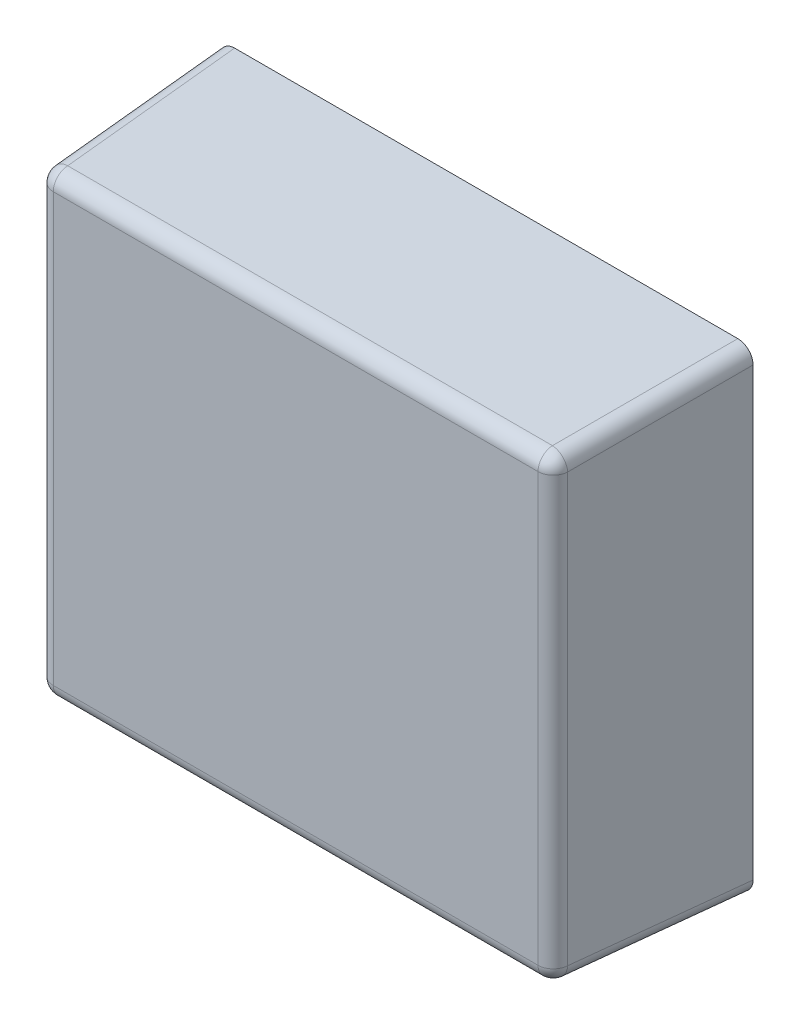
ISO-10303-21;
HEADER;
FILE_DESCRIPTION(('STEP AP214'),'2;1');
FILE_NAME('part.step','',(''),(''),'','','');
FILE_SCHEMA(('AUTOMOTIVE_DESIGN { 1 0 10303 214 1 1 1 1 }'));
ENDSEC;
DATA;
#1=APPLICATION_CONTEXT('core data for automotive mechanical design processes');
#2=APPLICATION_PROTOCOL_DEFINITION('international standard','automotive_design',2000,#1);
#3=PRODUCT_CONTEXT('',#1,'mechanical');
#4=PRODUCT('Part','Part','',(#3));
#5=PRODUCT_RELATED_PRODUCT_CATEGORY('part','',(#4));
#6=PRODUCT_DEFINITION_FORMATION('','',#4);
#7=PRODUCT_DEFINITION_CONTEXT('part definition',#1,'design');
#8=PRODUCT_DEFINITION('design','',#6,#7);
#9=PRODUCT_DEFINITION_SHAPE('','',#8);
#10=(LENGTH_UNIT() NAMED_UNIT(*) SI_UNIT(.MILLI.,.METRE.));
#11=(NAMED_UNIT(*) PLANE_ANGLE_UNIT() SI_UNIT($,.RADIAN.));
#12=(NAMED_UNIT(*) SI_UNIT($,.STERADIAN.) SOLID_ANGLE_UNIT());
#13=UNCERTAINTY_MEASURE_WITH_UNIT(LENGTH_MEASURE(1.E-05),#10,'distance_accuracy_value','');
#14=(GEOMETRIC_REPRESENTATION_CONTEXT(3) GLOBAL_UNCERTAINTY_ASSIGNED_CONTEXT((#13)) GLOBAL_UNIT_ASSIGNED_CONTEXT((#10,
#11,#12)) REPRESENTATION_CONTEXT('',''));
#15=CARTESIAN_POINT('',(0.,0.,0.));
#16=DIRECTION('',(0.,0.,1.));
#17=DIRECTION('',(1.,0.,0.));
#18=AXIS2_PLACEMENT_3D('',#15,#16,#17);
#19=CARTESIAN_POINT('',(-0.7,-0.625,0.5));
#20=DIRECTION('',(0.,0.,1.));
#21=DIRECTION('',(1.,0.,0.));
#22=AXIS2_PLACEMENT_3D('',#19,#20,#21);
#23=PLANE('',#22);
#24=DIRECTION('',(1.,0.,0.));
#25=VECTOR('',#24,1.);
#26=CARTESIAN_POINT('',(-0.35,-0.56083752769,0.5));
#27=LINE('',#26,#25);
#28=CARTESIAN_POINT('',(0.63583752769,-0.56083752769,0.5));
#29=VERTEX_POINT('',#28);
#30=CARTESIAN_POINT('',(-0.63583752769,-0.56083752769,0.5));
#31=VERTEX_POINT('',#30);
#32=EDGE_CURVE('E253',#29,#31,#27,.F.);
#33=ORIENTED_EDGE('',*,*,#32,.F.);
#34=DIRECTION('',(0.,-1.,0.));
#35=VECTOR('',#34,1.);
#36=CARTESIAN_POINT('',(0.63583752769,-0.3125,0.5));
#37=LINE('',#36,#35);
#38=CARTESIAN_POINT('',(0.63583752769,0.56083752769,0.5));
#39=VERTEX_POINT('',#38);
#40=EDGE_CURVE('E96',#39,#29,#37,.T.);
#41=ORIENTED_EDGE('',*,*,#40,.F.);
#42=DIRECTION('',(-1.,0.,0.));
#43=VECTOR('',#42,1.);
#44=CARTESIAN_POINT('',(-0.35,0.56083752769,0.5));
#45=LINE('',#44,#43);
#46=CARTESIAN_POINT('',(-0.63583752769,0.56083752769,0.5));
#47=VERTEX_POINT('',#46);
#48=EDGE_CURVE('E260',#47,#39,#45,.F.);
#49=ORIENTED_EDGE('',*,*,#48,.F.);
#50=DIRECTION('',(0.,-1.,0.));
#51=VECTOR('',#50,1.);
#52=CARTESIAN_POINT('',(-0.63583752769,-0.3125,0.5));
#53=LINE('',#52,#51);
#54=EDGE_CURVE('E258',#31,#47,#53,.F.);
#55=ORIENTED_EDGE('',*,*,#54,.F.);
#56=EDGE_LOOP('',(#33,#41,#49,#55));
#57=FACE_BOUND('',#56,.T.);
#58=ADVANCED_FACE('F17',(#57),#23,.T.);
#59=CARTESIAN_POINT('',(0.63583752769,-0.3125,0.46));
#60=DIRECTION('',(0.,-1.,0.));
#61=DIRECTION('',(1.,0.,0.));
#62=AXIS2_PLACEMENT_3D('',#59,#60,#61);
#63=CYLINDRICAL_SURFACE('',#62,0.04);
#64=CARTESIAN_POINT('',(0.63583752769,0.56083752769,0.46));
#65=DIRECTION('',(0.,-1.,0.));
#66=DIRECTION('',(1.,0.,0.));
#67=AXIS2_PLACEMENT_3D('',#64,#65,#66);
#68=CIRCLE('',#67,0.04);
#69=CARTESIAN_POINT('',(0.675782709080116,0.56083752769,0.462093438250006));
#70=VERTEX_POINT('',#69);
#71=EDGE_CURVE('E20',#39,#70,#68,.F.);
#72=ORIENTED_EDGE('',*,*,#71,.F.);
#73=ORIENTED_EDGE('',*,*,#40,.T.);
#74=CARTESIAN_POINT('',(0.63583752769,-0.56083752769,0.46));
#75=DIRECTION('',(0.,-1.,0.));
#76=DIRECTION('',(1.,0.,0.));
#77=AXIS2_PLACEMENT_3D('',#74,#75,#76);
#78=CIRCLE('',#77,0.04);
#79=CARTESIAN_POINT('',(0.675782709080077,-0.56083752769,0.462093438250466));
#80=VERTEX_POINT('',#79);
#81=EDGE_CURVE('E248',#80,#29,#78,.T.);
#82=ORIENTED_EDGE('',*,*,#81,.F.);
#83=DIRECTION('',(0.,1.,0.));
#84=VECTOR('',#83,1.);
#85=CARTESIAN_POINT('',(0.675782709080064,0.,0.462093438250003));
#86=LINE('',#85,#84);
#87=EDGE_CURVE('E119',#70,#80,#86,.F.);
#88=ORIENTED_EDGE('',*,*,#87,.F.);
#89=EDGE_LOOP('',(#72,#73,#82,#88));
#90=FACE_BOUND('',#89,.T.);
#91=ADVANCED_FACE('F105',(#90),#63,.T.);
#92=CARTESIAN_POINT('',(0.63583752769,0.56083752769,0.46));
#93=DIRECTION('',(0.556962487018036,0.556962487018204,0.61610516643604));
#94=DIRECTION('',(-0.741814855042063,-3.53134188557647E-13,0.670604742630802));
#95=AXIS2_PLACEMENT_3D('',#92,#93,#94);
#96=SPHERICAL_SURFACE('',#95,0.04);
#97=CARTESIAN_POINT('',(0.658116027170721,0.583116027170728,0.484644206657442));
#98=VERTEX_POINT('',#97);
#99=VERTEX_LOOP('',#98);
#100=FACE_BOUND('',#99,.T.);
#101=CARTESIAN_POINT('',(0.635837527689954,0.560837527689955,0.460000000000287));
#102=DIRECTION('',(-0.0522644276887224,-0.0522644276887224,0.997264688634236));
#103=DIRECTION('',(0.998629534754573,0.,0.0523359562429523));
#104=AXIS2_PLACEMENT_3D('',#101,#102,#103);
#105=CIRCLE('',#104,0.04);
#106=CARTESIAN_POINT('',(0.63583752769,0.600782709080116,0.462093438250006));
#107=VERTEX_POINT('',#106);
#108=EDGE_CURVE('E111',#107,#70,#105,.F.);
#109=ORIENTED_EDGE('',*,*,#108,.F.);
#110=CARTESIAN_POINT('',(0.63583752769,0.56083752769,0.46));
#111=DIRECTION('',(-1.,0.,0.));
#112=DIRECTION('',(0.,-1.,0.));
#113=AXIS2_PLACEMENT_3D('',#110,#111,#112);
#114=CIRCLE('',#113,0.04);
#115=EDGE_CURVE('E113',#39,#107,#114,.T.);
#116=ORIENTED_EDGE('',*,*,#115,.F.);
#117=ORIENTED_EDGE('',*,*,#71,.T.);
#118=EDGE_LOOP('',(#109,#116,#117));
#119=FACE_BOUND('',#118,.T.);
#120=ADVANCED_FACE('F101',(#100,#119),#96,.T.);
#121=CARTESIAN_POINT('',(-0.35,0.56083752769,0.46));
#122=DIRECTION('',(-1.,0.,0.));
#123=DIRECTION('',(0.,-1.,0.));
#124=AXIS2_PLACEMENT_3D('',#121,#122,#123);
#125=CYLINDRICAL_SURFACE('',#124,0.04);
#126=ORIENTED_EDGE('',*,*,#115,.T.);
#127=DIRECTION('',(1.,0.,0.));
#128=VECTOR('',#127,1.);
#129=CARTESIAN_POINT('',(0.,0.600782709080064,0.462093438250003));
#130=LINE('',#129,#128);
#131=CARTESIAN_POINT('',(-0.63583752769,0.600782709080116,0.462093438250006));
#132=VERTEX_POINT('',#131);
#133=EDGE_CURVE('E124',#132,#107,#130,.T.);
#134=ORIENTED_EDGE('',*,*,#133,.F.);
#135=CARTESIAN_POINT('',(-0.63583752769,0.56083752769,0.46));
#136=DIRECTION('',(-1.,0.,0.));
#137=DIRECTION('',(0.,-1.,0.));
#138=AXIS2_PLACEMENT_3D('',#135,#136,#137);
#139=CIRCLE('',#138,0.04);
#140=EDGE_CURVE('E259',#47,#132,#139,.T.);
#141=ORIENTED_EDGE('',*,*,#140,.F.);
#142=ORIENTED_EDGE('',*,*,#48,.T.);
#143=EDGE_LOOP('',(#126,#134,#141,#142));
#144=FACE_BOUND('',#143,.T.);
#145=ADVANCED_FACE('F104',(#144),#125,.T.);
#146=CARTESIAN_POINT('',(-0.63583752769,0.56083752769,0.46));
#147=DIRECTION('',(-0.556962487018036,0.556962487018204,0.61610516643604));
#148=DIRECTION('',(-0.741814855042063,3.53134188557647E-13,-0.670604742630802));
#149=AXIS2_PLACEMENT_3D('',#146,#147,#148);
#150=SPHERICAL_SURFACE('',#149,0.04);
#151=CARTESIAN_POINT('',(-0.658116027170721,0.583116027170728,0.484644206657442));
#152=VERTEX_POINT('',#151);
#153=VERTEX_LOOP('',#152);
#154=FACE_BOUND('',#153,.T.);
#155=ORIENTED_EDGE('',*,*,#140,.T.);
#156=CARTESIAN_POINT('',(-0.635837527689954,0.560837527689955,0.460000000000287));
#157=DIRECTION('',(0.0522644276887224,-0.0522644276887224,0.997264688634236));
#158=DIRECTION('',(0.998629534754573,0.,-0.0523359562429523));
#159=AXIS2_PLACEMENT_3D('',#156,#157,#158);
#160=CIRCLE('',#159,0.04);
#161=CARTESIAN_POINT('',(-0.675782709080116,0.560837527689999,0.462093438250006));
#162=VERTEX_POINT('',#161);
#163=EDGE_CURVE('E132',#162,#132,#160,.F.);
#164=ORIENTED_EDGE('',*,*,#163,.F.);
#165=CARTESIAN_POINT('',(-0.63583752769,0.56083752769,0.46));
#166=DIRECTION('',(0.,-1.,0.));
#167=DIRECTION('',(0.,0.,-1.));
#168=AXIS2_PLACEMENT_3D('',#165,#166,#167);
#169=CIRCLE('',#168,0.04);
#170=EDGE_CURVE('E256',#47,#162,#169,.T.);
#171=ORIENTED_EDGE('',*,*,#170,.F.);
#172=EDGE_LOOP('',(#155,#164,#171));
#173=FACE_BOUND('',#172,.T.);
#174=ADVANCED_FACE('F177',(#154,#173),#150,.T.);
#175=CARTESIAN_POINT('',(-0.63583752769,-0.3125,0.46));
#176=DIRECTION('',(0.,-1.,0.));
#177=DIRECTION('',(0.,0.,-1.));
#178=AXIS2_PLACEMENT_3D('',#175,#176,#177);
#179=CYLINDRICAL_SURFACE('',#178,0.04);
#180=ORIENTED_EDGE('',*,*,#170,.T.);
#181=DIRECTION('',(0.,1.,0.));
#182=VECTOR('',#181,1.);
#183=CARTESIAN_POINT('',(-0.675782709080064,0.,0.462093438250003));
#184=LINE('',#183,#182);
#185=CARTESIAN_POINT('',(-0.675782709080116,-0.56083752769,0.462093438250006));
#186=VERTEX_POINT('',#185);
#187=EDGE_CURVE('E171',#186,#162,#184,.T.);
#188=ORIENTED_EDGE('',*,*,#187,.F.);
#189=CARTESIAN_POINT('',(-0.63583752769,-0.56083752769,0.46));
#190=DIRECTION('',(0.,-1.,0.));
#191=DIRECTION('',(0.,0.,-1.));
#192=AXIS2_PLACEMENT_3D('',#189,#190,#191);
#193=CIRCLE('',#192,0.04);
#194=EDGE_CURVE('E254',#31,#186,#193,.T.);
#195=ORIENTED_EDGE('',*,*,#194,.F.);
#196=ORIENTED_EDGE('',*,*,#54,.T.);
#197=EDGE_LOOP('',(#180,#188,#195,#196));
#198=FACE_BOUND('',#197,.T.);
#199=ADVANCED_FACE('F167',(#198),#179,.T.);
#200=CARTESIAN_POINT('',(-0.63583752769,-0.56083752769,0.46));
#201=DIRECTION('',(-0.556962487018036,-0.556962487018204,0.61610516643604));
#202=DIRECTION('',(-0.741814855042063,-3.53134188557647E-13,-0.670604742630802));
#203=AXIS2_PLACEMENT_3D('',#200,#201,#202);
#204=SPHERICAL_SURFACE('',#203,0.04);
#205=CARTESIAN_POINT('',(-0.658116027170721,-0.583116027170728,0.484644206657442));
#206=VERTEX_POINT('',#205);
#207=VERTEX_LOOP('',#206);
#208=FACE_BOUND('',#207,.T.);
#209=CARTESIAN_POINT('',(-0.63583752769,-0.56083752769,0.46));
#210=DIRECTION('',(1.,0.,0.));
#211=DIRECTION('',(0.,1.,0.));
#212=AXIS2_PLACEMENT_3D('',#209,#210,#211);
#213=CIRCLE('',#212,0.04);
#214=CARTESIAN_POINT('',(-0.635837527689999,-0.600782709080116,0.462093438250006));
#215=VERTEX_POINT('',#214);
#216=EDGE_CURVE('E251',#31,#215,#213,.T.);
#217=ORIENTED_EDGE('',*,*,#216,.F.);
#218=ORIENTED_EDGE('',*,*,#194,.T.);
#219=CARTESIAN_POINT('',(-0.635837527689954,-0.560837527689955,0.460000000000287));
#220=DIRECTION('',(0.0522644276887224,0.0522644276887224,0.997264688634236));
#221=DIRECTION('',(0.998629534754573,0.,-0.0523359562429523));
#222=AXIS2_PLACEMENT_3D('',#219,#220,#221);
#223=CIRCLE('',#222,0.04);
#224=EDGE_CURVE('E240',#215,#186,#223,.F.);
#225=ORIENTED_EDGE('',*,*,#224,.F.);
#226=EDGE_LOOP('',(#217,#218,#225));
#227=FACE_BOUND('',#226,.T.);
#228=ADVANCED_FACE('F162',(#208,#227),#204,.T.);
#229=CARTESIAN_POINT('',(-0.35,-0.56083752769,0.46));
#230=DIRECTION('',(1.,0.,0.));
#231=DIRECTION('',(0.,1.,0.));
#232=AXIS2_PLACEMENT_3D('',#229,#230,#231);
#233=CYLINDRICAL_SURFACE('',#232,0.04);
#234=ORIENTED_EDGE('',*,*,#216,.T.);
#235=DIRECTION('',(1.,0.,0.));
#236=VECTOR('',#235,1.);
#237=CARTESIAN_POINT('',(0.,-0.600782709080064,0.462093438250003));
#238=LINE('',#237,#236);
#239=CARTESIAN_POINT('',(0.63583752769,-0.600782709080116,0.462093438250006));
#240=VERTEX_POINT('',#239);
#241=EDGE_CURVE('E143',#240,#215,#238,.F.);
#242=ORIENTED_EDGE('',*,*,#241,.F.);
#243=CARTESIAN_POINT('',(0.63583752769,-0.56083752769,0.46));
#244=DIRECTION('',(1.,0.,0.));
#245=DIRECTION('',(0.,1.,0.));
#246=AXIS2_PLACEMENT_3D('',#243,#244,#245);
#247=CIRCLE('',#246,0.04);
#248=EDGE_CURVE('E246',#29,#240,#247,.T.);
#249=ORIENTED_EDGE('',*,*,#248,.F.);
#250=ORIENTED_EDGE('',*,*,#32,.T.);
#251=EDGE_LOOP('',(#234,#242,#249,#250));
#252=FACE_BOUND('',#251,.T.);
#253=ADVANCED_FACE('F157',(#252),#233,.T.);
#254=CARTESIAN_POINT('',(0.63583752769,-0.56083752769,0.46));
#255=DIRECTION('',(0.556962487018036,-0.556962487018204,0.61610516643604));
#256=DIRECTION('',(-0.741814855042063,3.53134188557647E-13,0.670604742630802));
#257=AXIS2_PLACEMENT_3D('',#254,#255,#256);
#258=SPHERICAL_SURFACE('',#257,0.04);
#259=CARTESIAN_POINT('',(0.658116027170721,-0.583116027170728,0.484644206657442));
#260=VERTEX_POINT('',#259);
#261=VERTEX_LOOP('',#260);
#262=FACE_BOUND('',#261,.T.);
#263=ORIENTED_EDGE('',*,*,#81,.T.);
#264=ORIENTED_EDGE('',*,*,#248,.T.);
#265=CARTESIAN_POINT('',(0.635837527689954,-0.560837527689955,0.460000000000287));
#266=DIRECTION('',(0.0522644276887224,-0.0522644276887224,-0.997264688634236));
#267=DIRECTION('',(-0.998629534754573,0.,-0.0523359562429523));
#268=AXIS2_PLACEMENT_3D('',#265,#266,#267);
#269=CIRCLE('',#268,0.04);
#270=EDGE_CURVE('E237',#80,#240,#269,.T.);
#271=ORIENTED_EDGE('',*,*,#270,.F.);
#272=EDGE_LOOP('',(#263,#264,#271));
#273=FACE_BOUND('',#272,.T.);
#274=ADVANCED_FACE('F152',(#262,#273),#258,.T.);
#275=CARTESIAN_POINT('',(0.7,0.,0.));
#276=DIRECTION('',(0.998629534754575,0.,0.0523359562429177));
#277=DIRECTION('',(0.0523359562429177,0.,-0.998629534754575));
#278=AXIS2_PLACEMENT_3D('',#275,#276,#277);
#279=PLANE('',#278);
#280=DIRECTION('',(-0.0522644276887224,-0.0522644276887224,0.997264688634236));
#281=VECTOR('',#280,1.);
#282=CARTESIAN_POINT('',(0.698299447684183,0.583354266294,0.0324484711844381));
#283=LINE('',#282,#281);
#284=CARTESIAN_POINT('',(0.700000000000067,0.585054818609906,0.));
#285=VERTEX_POINT('',#284);
#286=EDGE_CURVE('E118',#70,#285,#283,.F.);
#287=ORIENTED_EDGE('',*,*,#286,.F.);
#288=ORIENTED_EDGE('',*,*,#87,.T.);
#289=DIRECTION('',(0.0522644276887224,-0.0522644276887224,-0.997264688634236));
#290=VECTOR('',#289,1.);
#291=CARTESIAN_POINT('',(0.698299447684183,-0.583354266294094,0.032448471184443));
#292=LINE('',#291,#290);
#293=CARTESIAN_POINT('',(0.700000000000067,-0.585054818609953,0.));
#294=VERTEX_POINT('',#293);
#295=EDGE_CURVE('E239',#294,#80,#292,.F.);
#296=ORIENTED_EDGE('',*,*,#295,.F.);
#297=DIRECTION('',(0.,1.,0.));
#298=VECTOR('',#297,1.);
#299=CARTESIAN_POINT('',(0.7,-0.625,0.));
#300=LINE('',#299,#298);
#301=EDGE_CURVE('E227',#294,#285,#300,.T.);
#302=ORIENTED_EDGE('',*,*,#301,.T.);
#303=EDGE_LOOP('',(#287,#288,#296,#302));
#304=FACE_BOUND('',#303,.T.);
#305=ADVANCED_FACE('F156',(#304),#279,.T.);
#306=CARTESIAN_POINT('',(0.658354266294,0.583354266294,0.03035503293472));
#307=DIRECTION('',(-0.0522644276887224,-0.0522644276887224,0.997264688634236));
#308=DIRECTION('',(0.998629534754573,0.,0.0523359562429523));
#309=AXIS2_PLACEMENT_3D('',#306,#307,#308);
#310=CYLINDRICAL_SURFACE('',#309,0.04);
#311=ORIENTED_EDGE('',*,*,#108,.T.);
#312=ORIENTED_EDGE('',*,*,#286,.T.);
#313=CARTESIAN_POINT('',(0.659945106160172,0.584945106160172,0.));
#314=DIRECTION('',(0.,0.,1.));
#315=DIRECTION('',(-0.707106781186548,-0.707106781186548,0.));
#316=AXIS2_PLACEMENT_3D('',#313,#314,#315);
#317=ELLIPSE('',#316,0.0401097125526227,0.04);
#318=CARTESIAN_POINT('',(0.660054818609953,0.625000000000045,0.));
#319=VERTEX_POINT('',#318);
#320=EDGE_CURVE('E137',#285,#319,#317,.T.);
#321=ORIENTED_EDGE('',*,*,#320,.T.);
#322=DIRECTION('',(0.0522644276888265,0.0522644276886875,-0.997264688634233));
#323=VECTOR('',#322,1.);
#324=CARTESIAN_POINT('',(0.63583752769,0.600782709080064,0.462093438250003));
#325=LINE('',#324,#323);
#326=EDGE_CURVE('E127',#107,#319,#325,.T.);
#327=ORIENTED_EDGE('',*,*,#326,.F.);
#328=EDGE_LOOP('',(#311,#312,#321,#327));
#329=FACE_BOUND('',#328,.T.);
#330=ADVANCED_FACE('F135',(#329),#310,.T.);
#331=CARTESIAN_POINT('',(0.,0.625,0.));
#332=DIRECTION('',(0.,0.998629534754575,0.0523359562429177));
#333=DIRECTION('',(0.,-0.0523359562429177,0.998629534754575));
#334=AXIS2_PLACEMENT_3D('',#331,#332,#333);
#335=PLANE('',#334);
#336=DIRECTION('',(0.0522644276887224,-0.0522644276887224,0.997264688634236));
#337=VECTOR('',#336,1.);
#338=CARTESIAN_POINT('',(-0.658354266294045,0.623299447684183,0.0324484711844405));
#339=LINE('',#338,#337);
#340=CARTESIAN_POINT('',(-0.660054818609929,0.625000000000067,0.));
#341=VERTEX_POINT('',#340);
#342=EDGE_CURVE('E129',#132,#341,#339,.F.);
#343=ORIENTED_EDGE('',*,*,#342,.F.);
#344=ORIENTED_EDGE('',*,*,#133,.T.);
#345=ORIENTED_EDGE('',*,*,#326,.T.);
#346=DIRECTION('',(1.,0.,0.));
#347=VECTOR('',#346,1.);
#348=CARTESIAN_POINT('',(-0.7,0.625,0.));
#349=LINE('',#348,#347);
#350=EDGE_CURVE('E229',#319,#341,#349,.F.);
#351=ORIENTED_EDGE('',*,*,#350,.T.);
#352=EDGE_LOOP('',(#343,#344,#345,#351));
#353=FACE_BOUND('',#352,.T.);
#354=ADVANCED_FACE('F125',(#353),#335,.T.);
#355=CARTESIAN_POINT('',(-0.658354266294,0.583354266294,0.03035503293472));
#356=DIRECTION('',(0.0522644276887224,-0.0522644276887224,0.997264688634236));
#357=DIRECTION('',(0.998629534754573,0.,-0.0523359562429523));
#358=AXIS2_PLACEMENT_3D('',#355,#356,#357);
#359=CYLINDRICAL_SURFACE('',#358,0.04);
#360=ORIENTED_EDGE('',*,*,#163,.T.);
#361=ORIENTED_EDGE('',*,*,#342,.T.);
#362=CARTESIAN_POINT('',(-0.659945106160172,0.584945106160172,0.));
#363=DIRECTION('',(0.,0.,1.));
#364=DIRECTION('',(0.707106781186548,-0.707106781186548,0.));
#365=AXIS2_PLACEMENT_3D('',#362,#363,#364);
#366=ELLIPSE('',#365,0.0401097125526227,0.04);
#367=CARTESIAN_POINT('',(-0.700000000000045,0.585054818609953,0.));
#368=VERTEX_POINT('',#367);
#369=EDGE_CURVE('E231',#341,#368,#366,.T.);
#370=ORIENTED_EDGE('',*,*,#369,.T.);
#371=DIRECTION('',(-0.0522644276886875,0.0522644276888263,-0.997264688634233));
#372=VECTOR('',#371,1.);
#373=CARTESIAN_POINT('',(-0.675782709080064,0.56083752769,0.462093438250003));
#374=LINE('',#373,#372);
#375=EDGE_CURVE('E243',#162,#368,#374,.T.);
#376=ORIENTED_EDGE('',*,*,#375,.F.);
#377=EDGE_LOOP('',(#360,#361,#370,#376));
#378=FACE_BOUND('',#377,.T.);
#379=ADVANCED_FACE('F210',(#378),#359,.T.);
#380=CARTESIAN_POINT('',(-0.7,0.,0.));
#381=DIRECTION('',(-0.998629534754575,0.,0.0523359562429177));
#382=DIRECTION('',(0.0523359562429177,0.,0.998629534754575));
#383=AXIS2_PLACEMENT_3D('',#380,#381,#382);
#384=PLANE('',#383);
#385=ORIENTED_EDGE('',*,*,#375,.T.);
#386=DIRECTION('',(0.,1.,0.));
#387=VECTOR('',#386,1.);
#388=CARTESIAN_POINT('',(-0.7,-0.625,0.));
#389=LINE('',#388,#387);
#390=CARTESIAN_POINT('',(-0.700000000000067,-0.585054818609929,0.));
#391=VERTEX_POINT('',#390);
#392=EDGE_CURVE('E266',#368,#391,#389,.F.);
#393=ORIENTED_EDGE('',*,*,#392,.T.);
#394=DIRECTION('',(0.0522644276887224,0.0522644276887224,0.997264688634236));
#395=VECTOR('',#394,1.);
#396=CARTESIAN_POINT('',(-0.698299447684183,-0.583354266294045,0.0324484711844405));
#397=LINE('',#396,#395);
#398=EDGE_CURVE('E147',#186,#391,#397,.F.);
#399=ORIENTED_EDGE('',*,*,#398,.F.);
#400=ORIENTED_EDGE('',*,*,#187,.T.);
#401=EDGE_LOOP('',(#385,#393,#399,#400));
#402=FACE_BOUND('',#401,.T.);
#403=ADVANCED_FACE('F206',(#402),#384,.T.);
#404=CARTESIAN_POINT('',(-0.658354266294,-0.583354266294,0.03035503293472));
#405=DIRECTION('',(0.0522644276887224,0.0522644276887224,0.997264688634236));
#406=DIRECTION('',(0.998629534754573,0.,-0.0523359562429523));
#407=AXIS2_PLACEMENT_3D('',#404,#405,#406);
#408=CYLINDRICAL_SURFACE('',#407,0.04);
#409=ORIENTED_EDGE('',*,*,#224,.T.);
#410=ORIENTED_EDGE('',*,*,#398,.T.);
#411=CARTESIAN_POINT('',(-0.659945106160172,-0.584945106160172,0.));
#412=DIRECTION('',(0.,0.,1.));
#413=DIRECTION('',(0.707106781186548,0.707106781186548,0.));
#414=AXIS2_PLACEMENT_3D('',#411,#412,#413);
#415=ELLIPSE('',#414,0.0401097125526227,0.04);
#416=CARTESIAN_POINT('',(-0.660054818609953,-0.625000000000045,0.));
#417=VERTEX_POINT('',#416);
#418=EDGE_CURVE('E264',#391,#417,#415,.T.);
#419=ORIENTED_EDGE('',*,*,#418,.T.);
#420=DIRECTION('',(-0.0522644276888265,-0.0522644276886875,-0.997264688634233));
#421=VECTOR('',#420,1.);
#422=CARTESIAN_POINT('',(-0.63583752769,-0.600782709080064,0.462093438250003));
#423=LINE('',#422,#421);
#424=EDGE_CURVE('E146',#215,#417,#423,.T.);
#425=ORIENTED_EDGE('',*,*,#424,.F.);
#426=EDGE_LOOP('',(#409,#410,#419,#425));
#427=FACE_BOUND('',#426,.T.);
#428=ADVANCED_FACE('F202',(#427),#408,.T.);
#429=CARTESIAN_POINT('',(0.,-0.625,0.));
#430=DIRECTION('',(0.,-0.998629534754575,0.0523359562429177));
#431=DIRECTION('',(0.,-0.0523359562429177,-0.998629534754575));
#432=AXIS2_PLACEMENT_3D('',#429,#430,#431);
#433=PLANE('',#432);
#434=ORIENTED_EDGE('',*,*,#424,.T.);
#435=DIRECTION('',(1.,0.,0.));
#436=VECTOR('',#435,1.);
#437=CARTESIAN_POINT('',(-0.7,-0.625,0.));
#438=LINE('',#437,#436);
#439=CARTESIAN_POINT('',(0.660054818609929,-0.625000000000067,0.));
#440=VERTEX_POINT('',#439);
#441=EDGE_CURVE('E26',#417,#440,#438,.T.);
#442=ORIENTED_EDGE('',*,*,#441,.T.);
#443=DIRECTION('',(0.0522644276887224,-0.0522644276887224,-0.997264688634236));
#444=VECTOR('',#443,1.);
#445=CARTESIAN_POINT('',(0.658354266294045,-0.623299447684183,0.0324484711844405));
#446=LINE('',#445,#444);
#447=EDGE_CURVE('E34',#240,#440,#446,.T.);
#448=ORIENTED_EDGE('',*,*,#447,.F.);
#449=ORIENTED_EDGE('',*,*,#241,.T.);
#450=EDGE_LOOP('',(#434,#442,#448,#449));
#451=FACE_BOUND('',#450,.T.);
#452=ADVANCED_FACE('F196',(#451),#433,.T.);
#453=CARTESIAN_POINT('',(0.658354266294,-0.583354266294,0.03035503293472));
#454=DIRECTION('',(0.0522644276887224,-0.0522644276887224,-0.997264688634236));
#455=DIRECTION('',(-0.998629534754573,0.,-0.0523359562429523));
#456=AXIS2_PLACEMENT_3D('',#453,#454,#455);
#457=CYLINDRICAL_SURFACE('',#456,0.04);
#458=ORIENTED_EDGE('',*,*,#270,.T.);
#459=ORIENTED_EDGE('',*,*,#447,.T.);
#460=CARTESIAN_POINT('',(0.659945106160172,-0.584945106160172,0.));
#461=DIRECTION('',(0.,0.,1.));
#462=DIRECTION('',(0.707106781186548,-0.707106781186548,0.));
#463=AXIS2_PLACEMENT_3D('',#460,#461,#462);
#464=ELLIPSE('',#463,0.0401097125526227,0.04);
#465=EDGE_CURVE('E11',#440,#294,#464,.T.);
#466=ORIENTED_EDGE('',*,*,#465,.T.);
#467=ORIENTED_EDGE('',*,*,#295,.T.);
#468=EDGE_LOOP('',(#458,#459,#466,#467));
#469=FACE_BOUND('',#468,.T.);
#470=ADVANCED_FACE('F190',(#469),#457,.T.);
#471=CARTESIAN_POINT('',(-0.7,-0.625,0.));
#472=DIRECTION('',(0.,0.,1.));
#473=DIRECTION('',(1.,0.,0.));
#474=AXIS2_PLACEMENT_3D('',#471,#472,#473);
#475=PLANE('',#474);
#476=ORIENTED_EDGE('',*,*,#441,.F.);
#477=ORIENTED_EDGE('',*,*,#418,.F.);
#478=ORIENTED_EDGE('',*,*,#392,.F.);
#479=ORIENTED_EDGE('',*,*,#369,.F.);
#480=ORIENTED_EDGE('',*,*,#350,.F.);
#481=ORIENTED_EDGE('',*,*,#320,.F.);
#482=ORIENTED_EDGE('',*,*,#301,.F.);
#483=ORIENTED_EDGE('',*,*,#465,.F.);
#484=EDGE_LOOP('',(#476,#477,#478,#479,#480,#481,#482,#483));
#485=FACE_BOUND('',#484,.T.);
#486=ADVANCED_FACE('F188',(#485),#475,.F.);
#487=CLOSED_SHELL('',(#58,#91,#120,#145,#174,#199,#228,#253,#274,#305,#330,#354,#379,#403,#428,
#452,#470,#486));
#488=MANIFOLD_SOLID_BREP('B1',#487);
#489=ADVANCED_BREP_SHAPE_REPRESENTATION('',(#18,#488),#14);
#490=SHAPE_DEFINITION_REPRESENTATION(#9,#489);
ENDSEC;
END-ISO-10303-21;
